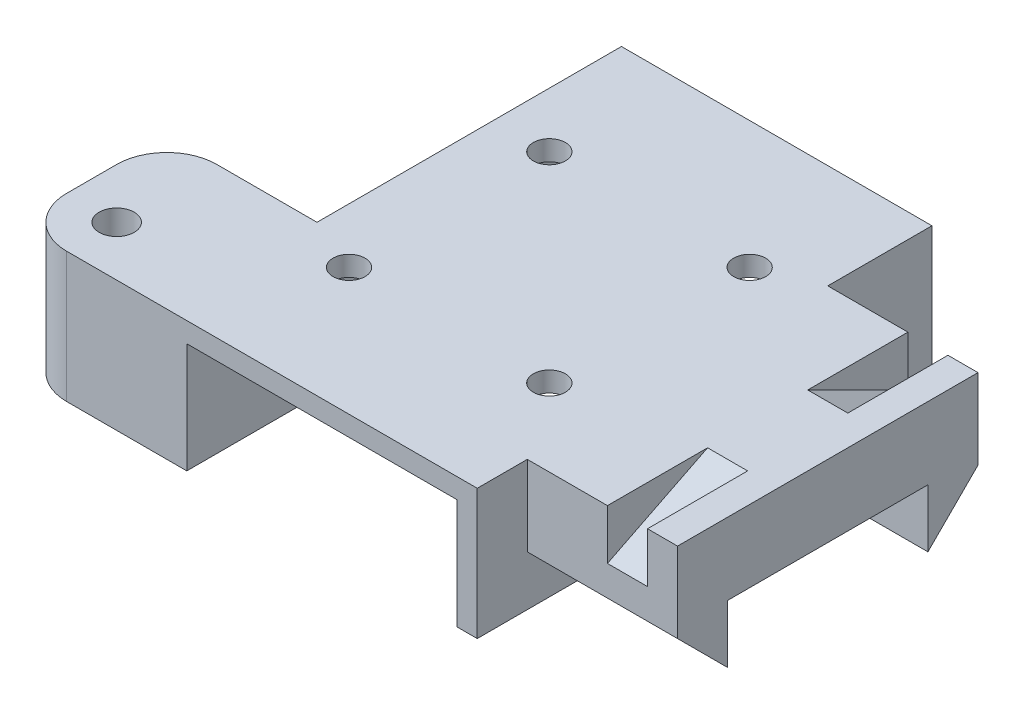
ISO-10303-21;
HEADER;
FILE_DESCRIPTION(('STEP AP214'),'2;1');
FILE_NAME('part.step','',(''),(''),'','','');
FILE_SCHEMA(('AUTOMOTIVE_DESIGN { 1 0 10303 214 1 1 1 1 }'));
ENDSEC;
DATA;
#1=APPLICATION_CONTEXT('core data for automotive mechanical design processes');
#2=APPLICATION_PROTOCOL_DEFINITION('international standard','automotive_design',2000,#1);
#3=PRODUCT_CONTEXT('',#1,'mechanical');
#4=PRODUCT('Part','Part','',(#3));
#5=PRODUCT_RELATED_PRODUCT_CATEGORY('part','',(#4));
#6=PRODUCT_DEFINITION_FORMATION('','',#4);
#7=PRODUCT_DEFINITION_CONTEXT('part definition',#1,'design');
#8=PRODUCT_DEFINITION('design','',#6,#7);
#9=PRODUCT_DEFINITION_SHAPE('','',#8);
#10=(LENGTH_UNIT() NAMED_UNIT(*) SI_UNIT(.MILLI.,.METRE.));
#11=(NAMED_UNIT(*) PLANE_ANGLE_UNIT() SI_UNIT($,.RADIAN.));
#12=(NAMED_UNIT(*) SI_UNIT($,.STERADIAN.) SOLID_ANGLE_UNIT());
#13=UNCERTAINTY_MEASURE_WITH_UNIT(LENGTH_MEASURE(1.E-05),#10,'distance_accuracy_value','');
#14=(GEOMETRIC_REPRESENTATION_CONTEXT(3) GLOBAL_UNCERTAINTY_ASSIGNED_CONTEXT((#13)) GLOBAL_UNIT_ASSIGNED_CONTEXT((#10,
#11,#12)) REPRESENTATION_CONTEXT('',''));
#15=CARTESIAN_POINT('',(0.,0.,0.));
#16=DIRECTION('',(0.,0.,1.));
#17=DIRECTION('',(1.,0.,0.));
#18=AXIS2_PLACEMENT_3D('',#15,#16,#17);
#19=CARTESIAN_POINT('',(0.,13.,0.));
#20=DIRECTION('',(0.,-1.,0.));
#21=DIRECTION('',(0.,0.,-1.));
#22=AXIS2_PLACEMENT_3D('',#19,#20,#21);
#23=PLANE('',#22);
#24=CARTESIAN_POINT('',(25.5,13.,-32.7));
#25=DIRECTION('',(0.,1.,0.));
#26=DIRECTION('',(0.,0.,1.));
#27=AXIS2_PLACEMENT_3D('',#24,#25,#26);
#28=CIRCLE('',#27,1.6);
#29=CARTESIAN_POINT('',(25.5,13.,-31.1));
#30=VERTEX_POINT('',#29);
#31=EDGE_CURVE('E325',#30,#30,#28,.T.);
#32=ORIENTED_EDGE('',*,*,#31,.F.);
#33=EDGE_LOOP('',(#32));
#34=FACE_BOUND('',#33,.T.);
#35=CARTESIAN_POINT('',(5.49999999999999,13.,-12.7));
#36=DIRECTION('',(0.,1.,0.));
#37=DIRECTION('',(0.,0.,1.));
#38=AXIS2_PLACEMENT_3D('',#35,#36,#37);
#39=CIRCLE('',#38,1.6);
#40=CARTESIAN_POINT('',(5.49999999999999,13.,-11.1));
#41=VERTEX_POINT('',#40);
#42=EDGE_CURVE('E318',#41,#41,#39,.T.);
#43=ORIENTED_EDGE('',*,*,#42,.F.);
#44=EDGE_LOOP('',(#43));
#45=FACE_BOUND('',#44,.T.);
#46=CARTESIAN_POINT('',(25.5,13.,-12.7));
#47=DIRECTION('',(0.,1.,0.));
#48=DIRECTION('',(0.,0.,1.));
#49=AXIS2_PLACEMENT_3D('',#46,#47,#48);
#50=CIRCLE('',#49,1.6);
#51=CARTESIAN_POINT('',(25.5,13.,-11.1));
#52=VERTEX_POINT('',#51);
#53=EDGE_CURVE('E321',#52,#52,#50,.T.);
#54=ORIENTED_EDGE('',*,*,#53,.F.);
#55=EDGE_LOOP('',(#54));
#56=FACE_BOUND('',#55,.T.);
#57=CARTESIAN_POINT('',(5.49999999999999,13.,-32.7));
#58=DIRECTION('',(0.,1.,0.));
#59=DIRECTION('',(0.,0.,1.));
#60=AXIS2_PLACEMENT_3D('',#57,#58,#59);
#61=CIRCLE('',#60,1.6);
#62=CARTESIAN_POINT('',(5.49999999999999,13.,-31.1));
#63=VERTEX_POINT('',#62);
#64=EDGE_CURVE('E322',#63,#63,#61,.T.);
#65=ORIENTED_EDGE('',*,*,#64,.F.);
#66=EDGE_LOOP('',(#65));
#67=FACE_BOUND('',#66,.T.);
#68=CARTESIAN_POINT('',(-10.,13.,-5.));
#69=DIRECTION('',(0.,1.,0.));
#70=DIRECTION('',(0.,0.,1.));
#71=AXIS2_PLACEMENT_3D('',#68,#69,#70);
#72=CIRCLE('',#71,1.75);
#73=CARTESIAN_POINT('',(-10.,13.,-3.25));
#74=VERTEX_POINT('',#73);
#75=EDGE_CURVE('E299',#74,#74,#72,.T.);
#76=ORIENTED_EDGE('',*,*,#75,.F.);
#77=EDGE_LOOP('',(#76));
#78=FACE_BOUND('',#77,.T.);
#79=DIRECTION('',(-1.,0.,0.));
#80=VECTOR('',#79,1.);
#81=CARTESIAN_POINT('',(46.,13.,-5.));
#82=LINE('',#81,#80);
#83=CARTESIAN_POINT('',(39.,13.,-5.));
#84=VERTEX_POINT('',#83);
#85=CARTESIAN_POINT('',(31.,13.,-5.));
#86=VERTEX_POINT('',#85);
#87=EDGE_CURVE('E267',#84,#86,#82,.T.);
#88=ORIENTED_EDGE('',*,*,#87,.F.);
#89=DIRECTION('',(0.,0.,1.));
#90=VECTOR('',#89,1.);
#91=CARTESIAN_POINT('',(39.,13.,-15.));
#92=LINE('',#91,#90);
#93=CARTESIAN_POINT('',(39.,13.,-15.));
#94=VERTEX_POINT('',#93);
#95=EDGE_CURVE('E217',#94,#84,#92,.T.);
#96=ORIENTED_EDGE('',*,*,#95,.F.);
#97=DIRECTION('',(1.,0.,0.));
#98=VECTOR('',#97,1.);
#99=CARTESIAN_POINT('',(39.,13.,-15.));
#100=LINE('',#99,#98);
#101=CARTESIAN_POINT('',(43.,13.,-15.));
#102=VERTEX_POINT('',#101);
#103=EDGE_CURVE('E214',#94,#102,#100,.T.);
#104=ORIENTED_EDGE('',*,*,#103,.T.);
#105=DIRECTION('',(0.,0.,1.));
#106=VECTOR('',#105,1.);
#107=CARTESIAN_POINT('',(43.,13.,-15.));
#108=LINE('',#107,#106);
#109=CARTESIAN_POINT('',(43.,13.,-5.));
#110=VERTEX_POINT('',#109);
#111=EDGE_CURVE('E224',#102,#110,#108,.T.);
#112=ORIENTED_EDGE('',*,*,#111,.T.);
#113=CARTESIAN_POINT('',(46.,13.,-5.));
#114=VERTEX_POINT('',#113);
#115=EDGE_CURVE('E281',#114,#110,#82,.T.);
#116=ORIENTED_EDGE('',*,*,#115,.F.);
#117=DIRECTION('',(0.,0.,1.));
#118=VECTOR('',#117,1.);
#119=CARTESIAN_POINT('',(46.,13.,-35.));
#120=LINE('',#119,#118);
#121=CARTESIAN_POINT('',(46.,13.,-35.));
#122=VERTEX_POINT('',#121);
#123=EDGE_CURVE('E265',#122,#114,#120,.T.);
#124=ORIENTED_EDGE('',*,*,#123,.F.);
#125=DIRECTION('',(-1.,0.,0.));
#126=VECTOR('',#125,1.);
#127=CARTESIAN_POINT('',(46.,13.,-35.));
#128=LINE('',#127,#126);
#129=CARTESIAN_POINT('',(43.,13.,-35.));
#130=VERTEX_POINT('',#129);
#131=EDGE_CURVE('E284',#122,#130,#128,.T.);
#132=ORIENTED_EDGE('',*,*,#131,.T.);
#133=DIRECTION('',(0.,0.,1.));
#134=VECTOR('',#133,1.);
#135=CARTESIAN_POINT('',(43.,13.,-25.));
#136=LINE('',#135,#134);
#137=CARTESIAN_POINT('',(43.,13.,-25.));
#138=VERTEX_POINT('',#137);
#139=EDGE_CURVE('E57',#130,#138,#136,.T.);
#140=ORIENTED_EDGE('',*,*,#139,.T.);
#141=DIRECTION('',(1.,0.,0.));
#142=VECTOR('',#141,1.);
#143=CARTESIAN_POINT('',(39.,13.,-25.));
#144=LINE('',#143,#142);
#145=CARTESIAN_POINT('',(39.,13.,-25.));
#146=VERTEX_POINT('',#145);
#147=EDGE_CURVE('E243',#146,#138,#144,.T.);
#148=ORIENTED_EDGE('',*,*,#147,.F.);
#149=DIRECTION('',(0.,0.,1.));
#150=VECTOR('',#149,1.);
#151=CARTESIAN_POINT('',(39.,13.,-25.));
#152=LINE('',#151,#150);
#153=CARTESIAN_POINT('',(39.,13.,-35.));
#154=VERTEX_POINT('',#153);
#155=EDGE_CURVE('E237',#154,#146,#152,.T.);
#156=ORIENTED_EDGE('',*,*,#155,.F.);
#157=CARTESIAN_POINT('',(31.,13.,-35.));
#158=VERTEX_POINT('',#157);
#159=EDGE_CURVE('E283',#154,#158,#128,.T.);
#160=ORIENTED_EDGE('',*,*,#159,.T.);
#161=DIRECTION('',(0.,0.,-1.));
#162=VECTOR('',#161,1.);
#163=CARTESIAN_POINT('',(31.,13.,0.));
#164=LINE('',#163,#162);
#165=CARTESIAN_POINT('',(31.,13.,-45.4));
#166=VERTEX_POINT('',#165);
#167=EDGE_CURVE('E366',#158,#166,#164,.T.);
#168=ORIENTED_EDGE('',*,*,#167,.T.);
#169=DIRECTION('',(-1.,0.,0.));
#170=VECTOR('',#169,1.);
#171=CARTESIAN_POINT('',(0.,13.,-45.4));
#172=LINE('',#171,#170);
#173=CARTESIAN_POINT('',(0.,13.,-45.4));
#174=VERTEX_POINT('',#173);
#175=EDGE_CURVE('E370',#166,#174,#172,.T.);
#176=ORIENTED_EDGE('',*,*,#175,.T.);
#177=DIRECTION('',(0.,0.,1.));
#178=VECTOR('',#177,1.);
#179=CARTESIAN_POINT('',(0.,13.,0.));
#180=LINE('',#179,#178);
#181=CARTESIAN_POINT('',(0.,13.,-15.));
#182=VERTEX_POINT('',#181);
#183=EDGE_CURVE('E360',#174,#182,#180,.T.);
#184=ORIENTED_EDGE('',*,*,#183,.T.);
#185=DIRECTION('',(1.,0.,0.));
#186=VECTOR('',#185,1.);
#187=CARTESIAN_POINT('',(-15.,13.,-15.));
#188=LINE('',#187,#186);
#189=CARTESIAN_POINT('',(-10.,13.,-15.));
#190=VERTEX_POINT('',#189);
#191=EDGE_CURVE('E312',#190,#182,#188,.T.);
#192=ORIENTED_EDGE('',*,*,#191,.F.);
#193=CARTESIAN_POINT('',(-10.,13.,-10.));
#194=DIRECTION('',(0.,-1.,0.));
#195=DIRECTION('',(0.,0.,-1.));
#196=AXIS2_PLACEMENT_3D('',#193,#194,#195);
#197=CIRCLE('',#196,5.);
#198=CARTESIAN_POINT('',(-15.,13.,-9.99999999999999));
#199=VERTEX_POINT('',#198);
#200=EDGE_CURVE('E417',#190,#199,#197,.F.);
#201=ORIENTED_EDGE('',*,*,#200,.T.);
#202=DIRECTION('',(0.,0.,-1.));
#203=VECTOR('',#202,1.);
#204=CARTESIAN_POINT('',(-15.,13.,-15.));
#205=LINE('',#204,#203);
#206=CARTESIAN_POINT('',(-15.,13.,-5.));
#207=VERTEX_POINT('',#206);
#208=EDGE_CURVE('E309',#207,#199,#205,.T.);
#209=ORIENTED_EDGE('',*,*,#208,.F.);
#210=CARTESIAN_POINT('',(-10.,13.,-5.));
#211=DIRECTION('',(0.,-1.,0.));
#212=DIRECTION('',(0.,0.,-1.));
#213=AXIS2_PLACEMENT_3D('',#210,#211,#212);
#214=CIRCLE('',#213,5.);
#215=CARTESIAN_POINT('',(-10.,13.,0.));
#216=VERTEX_POINT('',#215);
#217=EDGE_CURVE('E415',#207,#216,#214,.F.);
#218=ORIENTED_EDGE('',*,*,#217,.T.);
#219=DIRECTION('',(1.,0.,0.));
#220=VECTOR('',#219,1.);
#221=CARTESIAN_POINT('',(0.,13.,0.));
#222=LINE('',#221,#220);
#223=CARTESIAN_POINT('',(31.,13.,0.));
#224=VERTEX_POINT('',#223);
#225=EDGE_CURVE('E363',#216,#224,#222,.T.);
#226=ORIENTED_EDGE('',*,*,#225,.T.);
#227=EDGE_CURVE('E367',#224,#86,#164,.T.);
#228=ORIENTED_EDGE('',*,*,#227,.T.);
#229=EDGE_LOOP('',(#88,#96,#104,#112,#116,#124,#132,#140,#148,#156,#160,#168,#176,#184,#192,
#201,#209,#218,#226,#228));
#230=FACE_BOUND('',#229,.T.);
#231=ADVANCED_FACE('F34',(#34,#45,#56,#67,#78,#230),#23,.F.);
#232=CARTESIAN_POINT('',(46.,0.,-35.));
#233=DIRECTION('',(0.,0.,1.));
#234=DIRECTION('',(1.,0.,0.));
#235=AXIS2_PLACEMENT_3D('',#232,#233,#234);
#236=PLANE('',#235);
#237=DIRECTION('',(0.,1.,0.));
#238=VECTOR('',#237,1.);
#239=CARTESIAN_POINT('',(39.,13.,-35.));
#240=LINE('',#239,#238);
#241=CARTESIAN_POINT('',(39.,8.,-35.));
#242=VERTEX_POINT('',#241);
#243=EDGE_CURVE('E235',#242,#154,#240,.T.);
#244=ORIENTED_EDGE('',*,*,#243,.F.);
#245=DIRECTION('',(1.,0.,0.));
#246=VECTOR('',#245,1.);
#247=CARTESIAN_POINT('',(39.,8.,-35.));
#248=LINE('',#247,#246);
#249=CARTESIAN_POINT('',(43.,8.,-35.));
#250=VERTEX_POINT('',#249);
#251=EDGE_CURVE('E249',#242,#250,#248,.T.);
#252=ORIENTED_EDGE('',*,*,#251,.T.);
#253=DIRECTION('',(0.,1.,0.));
#254=VECTOR('',#253,1.);
#255=CARTESIAN_POINT('',(43.,13.,-35.));
#256=LINE('',#255,#254);
#257=EDGE_CURVE('E244',#250,#130,#256,.T.);
#258=ORIENTED_EDGE('',*,*,#257,.T.);
#259=ORIENTED_EDGE('',*,*,#131,.F.);
#260=DIRECTION('',(0.,1.,0.));
#261=VECTOR('',#260,1.);
#262=CARTESIAN_POINT('',(46.,0.,-35.));
#263=LINE('',#262,#261);
#264=CARTESIAN_POINT('',(46.,5.,-35.));
#265=VERTEX_POINT('',#264);
#266=EDGE_CURVE('E263',#265,#122,#263,.T.);
#267=ORIENTED_EDGE('',*,*,#266,.F.);
#268=DIRECTION('',(-1.,0.,0.));
#269=VECTOR('',#268,1.);
#270=CARTESIAN_POINT('',(31.,5.,-35.));
#271=LINE('',#270,#269);
#272=CARTESIAN_POINT('',(31.,5.,-35.));
#273=VERTEX_POINT('',#272);
#274=EDGE_CURVE('E427',#265,#273,#271,.T.);
#275=ORIENTED_EDGE('',*,*,#274,.T.);
#276=DIRECTION('',(0.,1.,0.));
#277=VECTOR('',#276,1.);
#278=CARTESIAN_POINT('',(31.,0.,-35.));
#279=LINE('',#278,#277);
#280=EDGE_CURVE('E257',#273,#158,#279,.T.);
#281=ORIENTED_EDGE('',*,*,#280,.T.);
#282=ORIENTED_EDGE('',*,*,#159,.F.);
#283=EDGE_LOOP('',(#244,#252,#258,#259,#267,#275,#281,#282));
#284=FACE_BOUND('',#283,.T.);
#285=ADVANCED_FACE('F463',(#284),#236,.F.);
#286=CARTESIAN_POINT('',(31.,13.,0.));
#287=DIRECTION('',(-1.,0.,0.));
#288=DIRECTION('',(0.,0.,1.));
#289=AXIS2_PLACEMENT_3D('',#286,#287,#288);
#290=PLANE('',#289);
#291=DIRECTION('',(0.,-1.,0.));
#292=VECTOR('',#291,1.);
#293=CARTESIAN_POINT('',(31.,13.,-5.));
#294=LINE('',#293,#292);
#295=CARTESIAN_POINT('',(31.,5.00000000000002,-5.));
#296=VERTEX_POINT('',#295);
#297=EDGE_CURVE('E230',#86,#296,#294,.T.);
#298=ORIENTED_EDGE('',*,*,#297,.F.);
#299=ORIENTED_EDGE('',*,*,#227,.F.);
#300=DIRECTION('',(0.,-1.,0.));
#301=VECTOR('',#300,1.);
#302=CARTESIAN_POINT('',(31.,13.,0.));
#303=LINE('',#302,#301);
#304=CARTESIAN_POINT('',(31.,0.,0.));
#305=VERTEX_POINT('',#304);
#306=EDGE_CURVE('E390',#224,#305,#303,.T.);
#307=ORIENTED_EDGE('',*,*,#306,.T.);
#308=DIRECTION('',(0.,0.,-1.));
#309=VECTOR('',#308,1.);
#310=CARTESIAN_POINT('',(31.,0.,0.));
#311=LINE('',#310,#309);
#312=CARTESIAN_POINT('',(31.,0.,-10.));
#313=VERTEX_POINT('',#312);
#314=EDGE_CURVE('E379',#305,#313,#311,.T.);
#315=ORIENTED_EDGE('',*,*,#314,.T.);
#316=DIRECTION('',(0.,0.707106781186549,0.707106781186546));
#317=VECTOR('',#316,1.);
#318=CARTESIAN_POINT('',(31.,11.5,1.49999999999997));
#319=LINE('',#318,#317);
#320=EDGE_CURVE('E42',#313,#296,#319,.T.);
#321=ORIENTED_EDGE('',*,*,#320,.T.);
#322=EDGE_LOOP('',(#298,#299,#307,#315,#321));
#323=FACE_BOUND('',#322,.T.);
#324=ADVANCED_FACE('F432',(#323),#290,.F.);
#325=ORIENTED_EDGE('',*,*,#280,.F.);
#326=DIRECTION('',(0.,-0.707106781186547,0.707106781186549));
#327=VECTOR('',#326,1.);
#328=CARTESIAN_POINT('',(31.,-8.50000000000001,-21.4999999999999));
#329=LINE('',#328,#327);
#330=CARTESIAN_POINT('',(31.,0.,-30.));
#331=VERTEX_POINT('',#330);
#332=EDGE_CURVE('E11',#273,#331,#329,.T.);
#333=ORIENTED_EDGE('',*,*,#332,.T.);
#334=CARTESIAN_POINT('',(31.,0.,-45.4));
#335=VERTEX_POINT('',#334);
#336=EDGE_CURVE('E378',#331,#335,#311,.T.);
#337=ORIENTED_EDGE('',*,*,#336,.T.);
#338=DIRECTION('',(0.,-1.,0.));
#339=VECTOR('',#338,1.);
#340=CARTESIAN_POINT('',(31.,13.,-45.4));
#341=LINE('',#340,#339);
#342=EDGE_CURVE('E387',#166,#335,#341,.T.);
#343=ORIENTED_EDGE('',*,*,#342,.F.);
#344=ORIENTED_EDGE('',*,*,#167,.F.);
#345=EDGE_LOOP('',(#325,#333,#337,#343,#344));
#346=FACE_BOUND('',#345,.T.);
#347=ADVANCED_FACE('F468',(#346),#290,.F.);
#348=DIRECTION('',(0.,-1.,0.));
#349=VECTOR('',#348,1.);
#350=CARTESIAN_POINT('',(31.,5.8,-30.));
#351=LINE('',#350,#349);
#352=CARTESIAN_POINT('',(31.,5.8,-30.));
#353=VERTEX_POINT('',#352);
#354=EDGE_CURVE('E276',#353,#331,#351,.T.);
#355=ORIENTED_EDGE('',*,*,#354,.F.);
#356=DIRECTION('',(0.,0.,-1.));
#357=VECTOR('',#356,1.);
#358=CARTESIAN_POINT('',(31.,5.8,-10.));
#359=LINE('',#358,#357);
#360=CARTESIAN_POINT('',(31.,5.8,-10.));
#361=VERTEX_POINT('',#360);
#362=EDGE_CURVE('E273',#361,#353,#359,.T.);
#363=ORIENTED_EDGE('',*,*,#362,.F.);
#364=DIRECTION('',(0.,1.,0.));
#365=VECTOR('',#364,1.);
#366=CARTESIAN_POINT('',(31.,0.,-10.));
#367=LINE('',#366,#365);
#368=EDGE_CURVE('E270',#313,#361,#367,.T.);
#369=ORIENTED_EDGE('',*,*,#368,.F.);
#370=EDGE_CURVE('E382',#313,#331,#311,.T.);
#371=ORIENTED_EDGE('',*,*,#370,.T.);
#372=EDGE_LOOP('',(#355,#363,#369,#371));
#373=FACE_BOUND('',#372,.T.);
#374=ADVANCED_FACE('F518',(#373),#290,.F.);
#375=CARTESIAN_POINT('',(0.,13.,0.));
#376=DIRECTION('',(1.,0.,0.));
#377=DIRECTION('',(0.,0.,-1.));
#378=AXIS2_PLACEMENT_3D('',#375,#376,#377);
#379=PLANE('',#378);
#380=DIRECTION('',(0.,-1.,0.));
#381=VECTOR('',#380,1.);
#382=CARTESIAN_POINT('',(0.,13.,-15.));
#383=LINE('',#382,#381);
#384=CARTESIAN_POINT('',(0.,0.,-15.));
#385=VERTEX_POINT('',#384);
#386=EDGE_CURVE('E305',#182,#385,#383,.T.);
#387=ORIENTED_EDGE('',*,*,#386,.F.);
#388=ORIENTED_EDGE('',*,*,#183,.F.);
#389=DIRECTION('',(0.,-1.,0.));
#390=VECTOR('',#389,1.);
#391=CARTESIAN_POINT('',(0.,13.,-45.4));
#392=LINE('',#391,#390);
#393=CARTESIAN_POINT('',(0.,0.,-45.4));
#394=VERTEX_POINT('',#393);
#395=EDGE_CURVE('E372',#174,#394,#392,.T.);
#396=ORIENTED_EDGE('',*,*,#395,.T.);
#397=DIRECTION('',(0.,0.,1.));
#398=VECTOR('',#397,1.);
#399=CARTESIAN_POINT('',(0.,0.,0.));
#400=LINE('',#399,#398);
#401=EDGE_CURVE('E353',#394,#385,#400,.T.);
#402=ORIENTED_EDGE('',*,*,#401,.T.);
#403=EDGE_LOOP('',(#387,#388,#396,#402));
#404=FACE_BOUND('',#403,.T.);
#405=ADVANCED_FACE('F522',(#404),#379,.F.);
#406=CARTESIAN_POINT('',(0.,0.,0.));
#407=DIRECTION('',(0.,-1.,0.));
#408=DIRECTION('',(0.,0.,-1.));
#409=AXIS2_PLACEMENT_3D('',#406,#407,#408);
#410=PLANE('',#409);
#411=CARTESIAN_POINT('',(-10.,0.,-5.));
#412=DIRECTION('',(0.,-1.,0.));
#413=DIRECTION('',(0.,0.,-1.));
#414=AXIS2_PLACEMENT_3D('',#411,#412,#413);
#415=CIRCLE('',#414,1.75);
#416=CARTESIAN_POINT('',(-10.,0.,-6.75));
#417=VERTEX_POINT('',#416);
#418=EDGE_CURVE('E302',#417,#417,#415,.T.);
#419=ORIENTED_EDGE('',*,*,#418,.F.);
#420=EDGE_LOOP('',(#419));
#421=FACE_BOUND('',#420,.T.);
#422=DIRECTION('',(0.,0.,1.));
#423=VECTOR('',#422,1.);
#424=CARTESIAN_POINT('',(-15.,0.,-15.));
#425=LINE('',#424,#423);
#426=CARTESIAN_POINT('',(-15.,0.,-9.99999999999999));
#427=VERTEX_POINT('',#426);
#428=CARTESIAN_POINT('',(-15.,0.,-5.));
#429=VERTEX_POINT('',#428);
#430=EDGE_CURVE('E306',#427,#429,#425,.T.);
#431=ORIENTED_EDGE('',*,*,#430,.F.);
#432=CARTESIAN_POINT('',(-10.,0.,-9.99999999999999));
#433=DIRECTION('',(0.,-1.,0.));
#434=DIRECTION('',(0.,0.,-1.));
#435=AXIS2_PLACEMENT_3D('',#432,#433,#434);
#436=CIRCLE('',#435,5.);
#437=CARTESIAN_POINT('',(-10.,0.,-15.));
#438=VERTEX_POINT('',#437);
#439=EDGE_CURVE('E411',#427,#438,#436,.T.);
#440=ORIENTED_EDGE('',*,*,#439,.T.);
#441=DIRECTION('',(1.,0.,0.));
#442=VECTOR('',#441,1.);
#443=CARTESIAN_POINT('',(-15.,0.,-15.));
#444=LINE('',#443,#442);
#445=EDGE_CURVE('E316',#438,#385,#444,.T.);
#446=ORIENTED_EDGE('',*,*,#445,.T.);
#447=ORIENTED_EDGE('',*,*,#401,.F.);
#448=DIRECTION('',(-1.,0.,0.));
#449=VECTOR('',#448,1.);
#450=CARTESIAN_POINT('',(0.,0.,-45.4));
#451=LINE('',#450,#449);
#452=CARTESIAN_POINT('',(2.,0.,-45.4));
#453=VERTEX_POINT('',#452);
#454=EDGE_CURVE('E381',#453,#394,#451,.T.);
#455=ORIENTED_EDGE('',*,*,#454,.F.);
#456=DIRECTION('',(0.,0.,1.));
#457=VECTOR('',#456,1.);
#458=CARTESIAN_POINT('',(2.,0.,-45.4));
#459=LINE('',#458,#457);
#460=CARTESIAN_POINT('',(2.,0.,0.));
#461=VERTEX_POINT('',#460);
#462=EDGE_CURVE('E341',#453,#461,#459,.T.);
#463=ORIENTED_EDGE('',*,*,#462,.T.);
#464=DIRECTION('',(1.,0.,0.));
#465=VECTOR('',#464,1.);
#466=CARTESIAN_POINT('',(0.,0.,0.));
#467=LINE('',#466,#465);
#468=CARTESIAN_POINT('',(-10.,0.,0.));
#469=VERTEX_POINT('',#468);
#470=EDGE_CURVE('E376',#469,#461,#467,.T.);
#471=ORIENTED_EDGE('',*,*,#470,.F.);
#472=CARTESIAN_POINT('',(-10.,0.,-5.));
#473=DIRECTION('',(0.,-1.,0.));
#474=DIRECTION('',(0.,0.,-1.));
#475=AXIS2_PLACEMENT_3D('',#472,#473,#474);
#476=CIRCLE('',#475,5.);
#477=EDGE_CURVE('E409',#469,#429,#476,.T.);
#478=ORIENTED_EDGE('',*,*,#477,.T.);
#479=EDGE_LOOP('',(#431,#440,#446,#447,#455,#463,#471,#478));
#480=FACE_BOUND('',#479,.T.);
#481=ADVANCED_FACE('F511',(#421,#480),#410,.T.);
#482=CARTESIAN_POINT('',(0.,13.,0.));
#483=DIRECTION('',(0.,0.,-1.));
#484=DIRECTION('',(-1.,0.,0.));
#485=AXIS2_PLACEMENT_3D('',#482,#483,#484);
#486=PLANE('',#485);
#487=ORIENTED_EDGE('',*,*,#225,.F.);
#488=DIRECTION('',(0.,1.,0.));
#489=VECTOR('',#488,1.);
#490=CARTESIAN_POINT('',(-10.,0.,0.));
#491=LINE('',#490,#489);
#492=EDGE_CURVE('E419',#216,#469,#491,.F.);
#493=ORIENTED_EDGE('',*,*,#492,.T.);
#494=ORIENTED_EDGE('',*,*,#470,.T.);
#495=DIRECTION('',(0.,-1.,0.));
#496=VECTOR('',#495,1.);
#497=CARTESIAN_POINT('',(2.,0.,0.));
#498=LINE('',#497,#496);
#499=CARTESIAN_POINT('',(2.,11.,0.));
#500=VERTEX_POINT('',#499);
#501=EDGE_CURVE('E342',#500,#461,#498,.T.);
#502=ORIENTED_EDGE('',*,*,#501,.F.);
#503=DIRECTION('',(-1.,0.,0.));
#504=VECTOR('',#503,1.);
#505=CARTESIAN_POINT('',(2.,11.,0.));
#506=LINE('',#505,#504);
#507=CARTESIAN_POINT('',(29.,11.,0.));
#508=VERTEX_POINT('',#507);
#509=EDGE_CURVE('E335',#508,#500,#506,.T.);
#510=ORIENTED_EDGE('',*,*,#509,.F.);
#511=DIRECTION('',(0.,1.,0.));
#512=VECTOR('',#511,1.);
#513=CARTESIAN_POINT('',(29.,0.,0.));
#514=LINE('',#513,#512);
#515=CARTESIAN_POINT('',(29.,0.,0.));
#516=VERTEX_POINT('',#515);
#517=EDGE_CURVE('E345',#516,#508,#514,.T.);
#518=ORIENTED_EDGE('',*,*,#517,.F.);
#519=EDGE_CURVE('E375',#516,#305,#467,.T.);
#520=ORIENTED_EDGE('',*,*,#519,.T.);
#521=ORIENTED_EDGE('',*,*,#306,.F.);
#522=EDGE_LOOP('',(#487,#493,#494,#502,#510,#518,#520,#521));
#523=FACE_BOUND('',#522,.T.);
#524=ADVANCED_FACE('F514',(#523),#486,.F.);
#525=CARTESIAN_POINT('',(0.,13.,-45.4));
#526=DIRECTION('',(0.,0.,1.));
#527=DIRECTION('',(1.,0.,0.));
#528=AXIS2_PLACEMENT_3D('',#525,#526,#527);
#529=PLANE('',#528);
#530=DIRECTION('',(-1.,0.,0.));
#531=VECTOR('',#530,1.);
#532=CARTESIAN_POINT('',(2.,11.,-45.4));
#533=LINE('',#532,#531);
#534=CARTESIAN_POINT('',(29.,11.,-45.4));
#535=VERTEX_POINT('',#534);
#536=CARTESIAN_POINT('',(2.,11.,-45.4));
#537=VERTEX_POINT('',#536);
#538=EDGE_CURVE('E338',#535,#537,#533,.T.);
#539=ORIENTED_EDGE('',*,*,#538,.T.);
#540=DIRECTION('',(0.,-1.,0.));
#541=VECTOR('',#540,1.);
#542=CARTESIAN_POINT('',(2.,0.,-45.4));
#543=LINE('',#542,#541);
#544=EDGE_CURVE('E331',#537,#453,#543,.T.);
#545=ORIENTED_EDGE('',*,*,#544,.T.);
#546=ORIENTED_EDGE('',*,*,#454,.T.);
#547=ORIENTED_EDGE('',*,*,#395,.F.);
#548=ORIENTED_EDGE('',*,*,#175,.F.);
#549=ORIENTED_EDGE('',*,*,#342,.T.);
#550=CARTESIAN_POINT('',(29.,0.,-45.4));
#551=VERTEX_POINT('',#550);
#552=EDGE_CURVE('E364',#335,#551,#451,.T.);
#553=ORIENTED_EDGE('',*,*,#552,.T.);
#554=DIRECTION('',(0.,1.,0.));
#555=VECTOR('',#554,1.);
#556=CARTESIAN_POINT('',(29.,0.,-45.4));
#557=LINE('',#556,#555);
#558=EDGE_CURVE('E334',#551,#535,#557,.T.);
#559=ORIENTED_EDGE('',*,*,#558,.T.);
#560=EDGE_LOOP('',(#539,#545,#546,#547,#548,#549,#553,#559));
#561=FACE_BOUND('',#560,.T.);
#562=ADVANCED_FACE('F509',(#561),#529,.F.);
#563=ORIENTED_EDGE('',*,*,#370,.F.);
#564=ORIENTED_EDGE('',*,*,#314,.F.);
#565=ORIENTED_EDGE('',*,*,#519,.F.);
#566=DIRECTION('',(0.,0.,1.));
#567=VECTOR('',#566,1.);
#568=CARTESIAN_POINT('',(29.,0.,-45.4));
#569=LINE('',#568,#567);
#570=EDGE_CURVE('E356',#551,#516,#569,.T.);
#571=ORIENTED_EDGE('',*,*,#570,.F.);
#572=ORIENTED_EDGE('',*,*,#552,.F.);
#573=ORIENTED_EDGE('',*,*,#336,.F.);
#574=EDGE_LOOP('',(#563,#564,#565,#571,#572,#573));
#575=FACE_BOUND('',#574,.T.);
#576=ADVANCED_FACE('F506',(#575),#410,.T.);
#577=CARTESIAN_POINT('',(2.,0.,-45.4));
#578=DIRECTION('',(-1.,0.,0.));
#579=DIRECTION('',(0.,0.,1.));
#580=AXIS2_PLACEMENT_3D('',#577,#578,#579);
#581=PLANE('',#580);
#582=ORIENTED_EDGE('',*,*,#501,.T.);
#583=ORIENTED_EDGE('',*,*,#462,.F.);
#584=ORIENTED_EDGE('',*,*,#544,.F.);
#585=DIRECTION('',(0.,0.,1.));
#586=VECTOR('',#585,1.);
#587=CARTESIAN_POINT('',(2.,11.,-45.4));
#588=LINE('',#587,#586);
#589=EDGE_CURVE('E351',#537,#500,#588,.T.);
#590=ORIENTED_EDGE('',*,*,#589,.T.);
#591=EDGE_LOOP('',(#582,#583,#584,#590));
#592=FACE_BOUND('',#591,.T.);
#593=ADVANCED_FACE('F504',(#592),#581,.F.);
#594=CARTESIAN_POINT('',(2.,11.,-45.4));
#595=DIRECTION('',(0.,1.,0.));
#596=DIRECTION('',(0.,0.,1.));
#597=AXIS2_PLACEMENT_3D('',#594,#595,#596);
#598=PLANE('',#597);
#599=CARTESIAN_POINT('',(5.49999999999999,11.,-32.7));
#600=DIRECTION('',(0.,1.,0.));
#601=DIRECTION('',(0.,0.,1.));
#602=AXIS2_PLACEMENT_3D('',#599,#600,#601);
#603=CIRCLE('',#602,1.6);
#604=CARTESIAN_POINT('',(5.49999999999999,11.,-31.1));
#605=VERTEX_POINT('',#604);
#606=EDGE_CURVE('E346',#605,#605,#603,.T.);
#607=ORIENTED_EDGE('',*,*,#606,.T.);
#608=EDGE_LOOP('',(#607));
#609=FACE_BOUND('',#608,.T.);
#610=CARTESIAN_POINT('',(25.5,11.,-12.7));
#611=DIRECTION('',(0.,1.,0.));
#612=DIRECTION('',(0.,0.,1.));
#613=AXIS2_PLACEMENT_3D('',#610,#611,#612);
#614=CIRCLE('',#613,1.6);
#615=CARTESIAN_POINT('',(25.5,11.,-11.1));
#616=VERTEX_POINT('',#615);
#617=EDGE_CURVE('E399',#616,#616,#614,.T.);
#618=ORIENTED_EDGE('',*,*,#617,.T.);
#619=EDGE_LOOP('',(#618));
#620=FACE_BOUND('',#619,.T.);
#621=CARTESIAN_POINT('',(5.49999999999999,11.,-12.7));
#622=DIRECTION('',(0.,1.,0.));
#623=DIRECTION('',(0.,0.,1.));
#624=AXIS2_PLACEMENT_3D('',#621,#622,#623);
#625=CIRCLE('',#624,1.6);
#626=CARTESIAN_POINT('',(5.49999999999999,11.,-11.1));
#627=VERTEX_POINT('',#626);
#628=EDGE_CURVE('E396',#627,#627,#625,.T.);
#629=ORIENTED_EDGE('',*,*,#628,.T.);
#630=EDGE_LOOP('',(#629));
#631=FACE_BOUND('',#630,.T.);
#632=CARTESIAN_POINT('',(25.5,11.,-32.7));
#633=DIRECTION('',(0.,1.,0.));
#634=DIRECTION('',(0.,0.,1.));
#635=AXIS2_PLACEMENT_3D('',#632,#633,#634);
#636=CIRCLE('',#635,1.6);
#637=CARTESIAN_POINT('',(25.5,11.,-31.1));
#638=VERTEX_POINT('',#637);
#639=EDGE_CURVE('E330',#638,#638,#636,.T.);
#640=ORIENTED_EDGE('',*,*,#639,.T.);
#641=EDGE_LOOP('',(#640));
#642=FACE_BOUND('',#641,.T.);
#643=ORIENTED_EDGE('',*,*,#509,.T.);
#644=ORIENTED_EDGE('',*,*,#589,.F.);
#645=ORIENTED_EDGE('',*,*,#538,.F.);
#646=DIRECTION('',(0.,0.,1.));
#647=VECTOR('',#646,1.);
#648=CARTESIAN_POINT('',(29.,11.,-45.4));
#649=LINE('',#648,#647);
#650=EDGE_CURVE('E354',#535,#508,#649,.T.);
#651=ORIENTED_EDGE('',*,*,#650,.T.);
#652=EDGE_LOOP('',(#643,#644,#645,#651));
#653=FACE_BOUND('',#652,.T.);
#654=ADVANCED_FACE('F579',(#609,#620,#631,#642,#653),#598,.F.);
#655=CARTESIAN_POINT('',(29.,0.,-45.4));
#656=DIRECTION('',(1.,0.,0.));
#657=DIRECTION('',(0.,0.,-1.));
#658=AXIS2_PLACEMENT_3D('',#655,#656,#657);
#659=PLANE('',#658);
#660=ORIENTED_EDGE('',*,*,#517,.T.);
#661=ORIENTED_EDGE('',*,*,#650,.F.);
#662=ORIENTED_EDGE('',*,*,#558,.F.);
#663=ORIENTED_EDGE('',*,*,#570,.T.);
#664=EDGE_LOOP('',(#660,#661,#662,#663));
#665=FACE_BOUND('',#664,.T.);
#666=ADVANCED_FACE('F577',(#665),#659,.F.);
#667=CARTESIAN_POINT('',(25.5,3.,-32.7));
#668=DIRECTION('',(0.,1.,0.));
#669=DIRECTION('',(0.,0.,1.));
#670=AXIS2_PLACEMENT_3D('',#667,#668,#669);
#671=CYLINDRICAL_SURFACE('',#670,1.6);
#672=ORIENTED_EDGE('',*,*,#31,.T.);
#673=EDGE_LOOP('',(#672));
#674=FACE_BOUND('',#673,.T.);
#675=ORIENTED_EDGE('',*,*,#639,.F.);
#676=EDGE_LOOP('',(#675));
#677=FACE_BOUND('',#676,.T.);
#678=ADVANCED_FACE('F567',(#674,#677),#671,.F.);
#679=CARTESIAN_POINT('',(5.49999999999999,3.,-12.7));
#680=DIRECTION('',(0.,1.,0.));
#681=DIRECTION('',(0.,0.,1.));
#682=AXIS2_PLACEMENT_3D('',#679,#680,#681);
#683=CYLINDRICAL_SURFACE('',#682,1.6);
#684=ORIENTED_EDGE('',*,*,#42,.T.);
#685=EDGE_LOOP('',(#684));
#686=FACE_BOUND('',#685,.T.);
#687=ORIENTED_EDGE('',*,*,#628,.F.);
#688=EDGE_LOOP('',(#687));
#689=FACE_BOUND('',#688,.T.);
#690=ADVANCED_FACE('F563',(#686,#689),#683,.F.);
#691=CARTESIAN_POINT('',(25.5,3.,-12.7));
#692=DIRECTION('',(0.,1.,0.));
#693=DIRECTION('',(0.,0.,1.));
#694=AXIS2_PLACEMENT_3D('',#691,#692,#693);
#695=CYLINDRICAL_SURFACE('',#694,1.6);
#696=ORIENTED_EDGE('',*,*,#53,.T.);
#697=EDGE_LOOP('',(#696));
#698=FACE_BOUND('',#697,.T.);
#699=ORIENTED_EDGE('',*,*,#617,.F.);
#700=EDGE_LOOP('',(#699));
#701=FACE_BOUND('',#700,.T.);
#702=ADVANCED_FACE('F566',(#698,#701),#695,.F.);
#703=CARTESIAN_POINT('',(5.49999999999999,3.,-32.7));
#704=DIRECTION('',(0.,1.,0.));
#705=DIRECTION('',(0.,0.,1.));
#706=AXIS2_PLACEMENT_3D('',#703,#704,#705);
#707=CYLINDRICAL_SURFACE('',#706,1.6);
#708=ORIENTED_EDGE('',*,*,#64,.T.);
#709=EDGE_LOOP('',(#708));
#710=FACE_BOUND('',#709,.T.);
#711=ORIENTED_EDGE('',*,*,#606,.F.);
#712=EDGE_LOOP('',(#711));
#713=FACE_BOUND('',#712,.T.);
#714=ADVANCED_FACE('F561',(#710,#713),#707,.F.);
#715=CARTESIAN_POINT('',(-15.,13.,-15.));
#716=DIRECTION('',(0.,0.,1.));
#717=DIRECTION('',(1.,0.,0.));
#718=AXIS2_PLACEMENT_3D('',#715,#716,#717);
#719=PLANE('',#718);
#720=ORIENTED_EDGE('',*,*,#445,.F.);
#721=DIRECTION('',(0.,-1.,0.));
#722=VECTOR('',#721,1.);
#723=CARTESIAN_POINT('',(-10.,13.,-15.));
#724=LINE('',#723,#722);
#725=EDGE_CURVE('E413',#438,#190,#724,.F.);
#726=ORIENTED_EDGE('',*,*,#725,.T.);
#727=ORIENTED_EDGE('',*,*,#191,.T.);
#728=ORIENTED_EDGE('',*,*,#386,.T.);
#729=EDGE_LOOP('',(#720,#726,#727,#728));
#730=FACE_BOUND('',#729,.T.);
#731=ADVANCED_FACE('F557',(#730),#719,.F.);
#732=CARTESIAN_POINT('',(-15.,0.,0.));
#733=DIRECTION('',(-1.,0.,0.));
#734=DIRECTION('',(0.,0.,1.));
#735=AXIS2_PLACEMENT_3D('',#732,#733,#734);
#736=PLANE('',#735);
#737=ORIENTED_EDGE('',*,*,#208,.T.);
#738=DIRECTION('',(0.,-1.,0.));
#739=VECTOR('',#738,1.);
#740=CARTESIAN_POINT('',(-15.,0.,-9.99999999999999));
#741=LINE('',#740,#739);
#742=EDGE_CURVE('E406',#199,#427,#741,.T.);
#743=ORIENTED_EDGE('',*,*,#742,.T.);
#744=ORIENTED_EDGE('',*,*,#430,.T.);
#745=DIRECTION('',(0.,1.,0.));
#746=VECTOR('',#745,1.);
#747=CARTESIAN_POINT('',(-15.,13.,-5.));
#748=LINE('',#747,#746);
#749=EDGE_CURVE('E393',#429,#207,#748,.T.);
#750=ORIENTED_EDGE('',*,*,#749,.T.);
#751=EDGE_LOOP('',(#737,#743,#744,#750));
#752=FACE_BOUND('',#751,.T.);
#753=ADVANCED_FACE('F553',(#752),#736,.T.);
#754=CARTESIAN_POINT('',(-10.,-7.,-5.));
#755=DIRECTION('',(0.,1.,0.));
#756=DIRECTION('',(0.,0.,1.));
#757=AXIS2_PLACEMENT_3D('',#754,#755,#756);
#758=CYLINDRICAL_SURFACE('',#757,1.75);
#759=ORIENTED_EDGE('',*,*,#418,.T.);
#760=EDGE_LOOP('',(#759));
#761=FACE_BOUND('',#760,.T.);
#762=ORIENTED_EDGE('',*,*,#75,.T.);
#763=EDGE_LOOP('',(#762));
#764=FACE_BOUND('',#763,.T.);
#765=ADVANCED_FACE('F530',(#761,#764),#758,.F.);
#766=CARTESIAN_POINT('',(-10.,0.,-9.99999999999999));
#767=DIRECTION('',(0.,1.,0.));
#768=DIRECTION('',(0.,0.,1.));
#769=AXIS2_PLACEMENT_3D('',#766,#767,#768);
#770=CYLINDRICAL_SURFACE('',#769,5.);
#771=ORIENTED_EDGE('',*,*,#200,.F.);
#772=ORIENTED_EDGE('',*,*,#725,.F.);
#773=ORIENTED_EDGE('',*,*,#439,.F.);
#774=ORIENTED_EDGE('',*,*,#742,.F.);
#775=EDGE_LOOP('',(#771,#772,#773,#774));
#776=FACE_BOUND('',#775,.T.);
#777=ADVANCED_FACE('F526',(#776),#770,.T.);
#778=CARTESIAN_POINT('',(-10.,0.,-5.));
#779=DIRECTION('',(0.,-1.,0.));
#780=DIRECTION('',(1.,0.,0.));
#781=AXIS2_PLACEMENT_3D('',#778,#779,#780);
#782=CYLINDRICAL_SURFACE('',#781,5.);
#783=ORIENTED_EDGE('',*,*,#477,.F.);
#784=ORIENTED_EDGE('',*,*,#492,.F.);
#785=ORIENTED_EDGE('',*,*,#217,.F.);
#786=ORIENTED_EDGE('',*,*,#749,.F.);
#787=EDGE_LOOP('',(#783,#784,#785,#786));
#788=FACE_BOUND('',#787,.T.);
#789=ADVANCED_FACE('F529',(#788),#782,.T.);
#790=CARTESIAN_POINT('',(46.,13.,-5.));
#791=DIRECTION('',(0.,0.,-1.));
#792=DIRECTION('',(-1.,0.,0.));
#793=AXIS2_PLACEMENT_3D('',#790,#791,#792);
#794=PLANE('',#793);
#795=DIRECTION('',(1.,0.,0.));
#796=VECTOR('',#795,1.);
#797=CARTESIAN_POINT('',(39.,8.,-5.));
#798=LINE('',#797,#796);
#799=CARTESIAN_POINT('',(39.,8.,-5.));
#800=VERTEX_POINT('',#799);
#801=CARTESIAN_POINT('',(43.,8.,-5.));
#802=VERTEX_POINT('',#801);
#803=EDGE_CURVE('E211',#800,#802,#798,.T.);
#804=ORIENTED_EDGE('',*,*,#803,.F.);
#805=DIRECTION('',(0.,-1.,0.));
#806=VECTOR('',#805,1.);
#807=CARTESIAN_POINT('',(39.,13.,-5.));
#808=LINE('',#807,#806);
#809=EDGE_CURVE('E218',#84,#800,#808,.T.);
#810=ORIENTED_EDGE('',*,*,#809,.F.);
#811=ORIENTED_EDGE('',*,*,#87,.T.);
#812=ORIENTED_EDGE('',*,*,#297,.T.);
#813=DIRECTION('',(1.,0.,0.));
#814=VECTOR('',#813,1.);
#815=CARTESIAN_POINT('',(46.,5.00000000000002,-5.));
#816=LINE('',#815,#814);
#817=CARTESIAN_POINT('',(46.,5.00000000000002,-5.));
#818=VERTEX_POINT('',#817);
#819=EDGE_CURVE('E421',#296,#818,#816,.T.);
#820=ORIENTED_EDGE('',*,*,#819,.T.);
#821=DIRECTION('',(0.,-1.,0.));
#822=VECTOR('',#821,1.);
#823=CARTESIAN_POINT('',(46.,13.,-5.));
#824=LINE('',#823,#822);
#825=EDGE_CURVE('E253',#114,#818,#824,.T.);
#826=ORIENTED_EDGE('',*,*,#825,.F.);
#827=ORIENTED_EDGE('',*,*,#115,.T.);
#828=DIRECTION('',(0.,-1.,0.));
#829=VECTOR('',#828,1.);
#830=CARTESIAN_POINT('',(43.,13.,-5.));
#831=LINE('',#830,#829);
#832=EDGE_CURVE('E228',#110,#802,#831,.T.);
#833=ORIENTED_EDGE('',*,*,#832,.T.);
#834=EDGE_LOOP('',(#804,#810,#811,#812,#820,#826,#827,#833));
#835=FACE_BOUND('',#834,.T.);
#836=ADVANCED_FACE('F226',(#835),#794,.F.);
#837=CARTESIAN_POINT('',(46.,0.,-10.));
#838=DIRECTION('',(0.,0.,1.));
#839=DIRECTION('',(1.,0.,0.));
#840=AXIS2_PLACEMENT_3D('',#837,#838,#839);
#841=PLANE('',#840);
#842=ORIENTED_EDGE('',*,*,#368,.T.);
#843=DIRECTION('',(-1.,0.,0.));
#844=VECTOR('',#843,1.);
#845=CARTESIAN_POINT('',(46.,5.8,-10.));
#846=LINE('',#845,#844);
#847=CARTESIAN_POINT('',(46.,5.8,-10.));
#848=VERTEX_POINT('',#847);
#849=EDGE_CURVE('E293',#848,#361,#846,.T.);
#850=ORIENTED_EDGE('',*,*,#849,.F.);
#851=DIRECTION('',(0.,1.,0.));
#852=VECTOR('',#851,1.);
#853=CARTESIAN_POINT('',(46.,0.,-10.));
#854=LINE('',#853,#852);
#855=CARTESIAN_POINT('',(46.,0.,-10.));
#856=VERTEX_POINT('',#855);
#857=EDGE_CURVE('E256',#856,#848,#854,.T.);
#858=ORIENTED_EDGE('',*,*,#857,.F.);
#859=DIRECTION('',(-1.,0.,0.));
#860=VECTOR('',#859,1.);
#861=CARTESIAN_POINT('',(46.,0.,-10.));
#862=LINE('',#861,#860);
#863=EDGE_CURVE('E296',#856,#313,#862,.T.);
#864=ORIENTED_EDGE('',*,*,#863,.T.);
#865=EDGE_LOOP('',(#842,#850,#858,#864));
#866=FACE_BOUND('',#865,.T.);
#867=ADVANCED_FACE('F447',(#866),#841,.F.);
#868=CARTESIAN_POINT('',(46.,5.8,-10.));
#869=DIRECTION('',(0.,1.,0.));
#870=DIRECTION('',(0.,0.,1.));
#871=AXIS2_PLACEMENT_3D('',#868,#869,#870);
#872=PLANE('',#871);
#873=ORIENTED_EDGE('',*,*,#362,.T.);
#874=DIRECTION('',(-1.,0.,0.));
#875=VECTOR('',#874,1.);
#876=CARTESIAN_POINT('',(46.,5.8,-30.));
#877=LINE('',#876,#875);
#878=CARTESIAN_POINT('',(46.,5.8,-30.));
#879=VERTEX_POINT('',#878);
#880=EDGE_CURVE('E290',#879,#353,#877,.T.);
#881=ORIENTED_EDGE('',*,*,#880,.F.);
#882=DIRECTION('',(0.,0.,-1.));
#883=VECTOR('',#882,1.);
#884=CARTESIAN_POINT('',(46.,5.8,-10.));
#885=LINE('',#884,#883);
#886=EDGE_CURVE('E259',#848,#879,#885,.T.);
#887=ORIENTED_EDGE('',*,*,#886,.F.);
#888=ORIENTED_EDGE('',*,*,#849,.T.);
#889=EDGE_LOOP('',(#873,#881,#887,#888));
#890=FACE_BOUND('',#889,.T.);
#891=ADVANCED_FACE('F451',(#890),#872,.F.);
#892=CARTESIAN_POINT('',(46.,5.8,-30.));
#893=DIRECTION('',(0.,0.,-1.));
#894=DIRECTION('',(-1.,0.,0.));
#895=AXIS2_PLACEMENT_3D('',#892,#893,#894);
#896=PLANE('',#895);
#897=ORIENTED_EDGE('',*,*,#354,.T.);
#898=DIRECTION('',(-1.,0.,0.));
#899=VECTOR('',#898,1.);
#900=CARTESIAN_POINT('',(46.,0.,-30.));
#901=LINE('',#900,#899);
#902=CARTESIAN_POINT('',(46.,0.,-30.));
#903=VERTEX_POINT('',#902);
#904=EDGE_CURVE('E287',#903,#331,#901,.T.);
#905=ORIENTED_EDGE('',*,*,#904,.F.);
#906=DIRECTION('',(0.,-1.,0.));
#907=VECTOR('',#906,1.);
#908=CARTESIAN_POINT('',(46.,5.8,-30.));
#909=LINE('',#908,#907);
#910=EDGE_CURVE('E261',#879,#903,#909,.T.);
#911=ORIENTED_EDGE('',*,*,#910,.F.);
#912=ORIENTED_EDGE('',*,*,#880,.T.);
#913=EDGE_LOOP('',(#897,#905,#911,#912));
#914=FACE_BOUND('',#913,.T.);
#915=ADVANCED_FACE('F457',(#914),#896,.F.);
#916=CARTESIAN_POINT('',(46.,0.,0.));
#917=DIRECTION('',(1.,0.,0.));
#918=DIRECTION('',(0.,0.,-1.));
#919=AXIS2_PLACEMENT_3D('',#916,#917,#918);
#920=PLANE('',#919);
#921=ORIENTED_EDGE('',*,*,#825,.T.);
#922=DIRECTION('',(0.,-0.707106781186549,-0.707106781186546));
#923=VECTOR('',#922,1.);
#924=CARTESIAN_POINT('',(46.,5.,-5.00000000000003));
#925=LINE('',#924,#923);
#926=EDGE_CURVE('E425',#818,#856,#925,.T.);
#927=ORIENTED_EDGE('',*,*,#926,.T.);
#928=ORIENTED_EDGE('',*,*,#857,.T.);
#929=ORIENTED_EDGE('',*,*,#886,.T.);
#930=ORIENTED_EDGE('',*,*,#910,.T.);
#931=DIRECTION('',(0.,0.707106781186547,-0.707106781186549));
#932=VECTOR('',#931,1.);
#933=CARTESIAN_POINT('',(46.,-15.,-15.));
#934=LINE('',#933,#932);
#935=EDGE_CURVE('E423',#903,#265,#934,.T.);
#936=ORIENTED_EDGE('',*,*,#935,.T.);
#937=ORIENTED_EDGE('',*,*,#266,.T.);
#938=ORIENTED_EDGE('',*,*,#123,.T.);
#939=EDGE_LOOP('',(#921,#927,#928,#929,#930,#936,#937,#938));
#940=FACE_BOUND('',#939,.T.);
#941=ADVANCED_FACE('F444',(#940),#920,.T.);
#942=CARTESIAN_POINT('',(0.,0.,-10.));
#943=DIRECTION('',(0.,-0.707106781186546,0.707106781186549));
#944=DIRECTION('',(1.,0.,0.));
#945=AXIS2_PLACEMENT_3D('',#942,#943,#944);
#946=PLANE('',#945);
#947=ORIENTED_EDGE('',*,*,#926,.F.);
#948=ORIENTED_EDGE('',*,*,#819,.F.);
#949=ORIENTED_EDGE('',*,*,#320,.F.);
#950=ORIENTED_EDGE('',*,*,#863,.F.);
#951=EDGE_LOOP('',(#947,#948,#949,#950));
#952=FACE_BOUND('',#951,.T.);
#953=ADVANCED_FACE('F441',(#952),#946,.T.);
#954=CARTESIAN_POINT('',(46.,5.,-35.));
#955=DIRECTION('',(0.,-0.707106781186549,-0.707106781186547));
#956=DIRECTION('',(1.,0.,0.));
#957=AXIS2_PLACEMENT_3D('',#954,#955,#956);
#958=PLANE('',#957);
#959=ORIENTED_EDGE('',*,*,#935,.F.);
#960=ORIENTED_EDGE('',*,*,#904,.T.);
#961=ORIENTED_EDGE('',*,*,#332,.F.);
#962=ORIENTED_EDGE('',*,*,#274,.F.);
#963=EDGE_LOOP('',(#959,#960,#961,#962));
#964=FACE_BOUND('',#963,.T.);
#965=ADVANCED_FACE('F36',(#964),#958,.T.);
#966=CARTESIAN_POINT('',(39.,8.,-35.));
#967=DIRECTION('',(0.,-0.894427190999916,0.447213595499958));
#968=DIRECTION('',(0.,-0.447213595499958,-0.894427190999916));
#969=AXIS2_PLACEMENT_3D('',#966,#967,#968);
#970=PLANE('',#969);
#971=DIRECTION('',(0.,-0.447213595499958,-0.894427190999916));
#972=VECTOR('',#971,1.);
#973=CARTESIAN_POINT('',(43.,8.,-35.));
#974=LINE('',#973,#972);
#975=EDGE_CURVE('E238',#138,#250,#974,.T.);
#976=ORIENTED_EDGE('',*,*,#975,.T.);
#977=ORIENTED_EDGE('',*,*,#251,.F.);
#978=DIRECTION('',(0.,-0.447213595499958,-0.894427190999916));
#979=VECTOR('',#978,1.);
#980=CARTESIAN_POINT('',(39.,8.,-35.));
#981=LINE('',#980,#979);
#982=EDGE_CURVE('E240',#146,#242,#981,.T.);
#983=ORIENTED_EDGE('',*,*,#982,.F.);
#984=ORIENTED_EDGE('',*,*,#147,.T.);
#985=EDGE_LOOP('',(#976,#977,#983,#984));
#986=FACE_BOUND('',#985,.T.);
#987=ADVANCED_FACE('F480',(#986),#970,.F.);
#988=CARTESIAN_POINT('',(39.,0.,0.));
#989=DIRECTION('',(1.,0.,0.));
#990=DIRECTION('',(0.,0.,-1.));
#991=AXIS2_PLACEMENT_3D('',#988,#989,#990);
#992=PLANE('',#991);
#993=ORIENTED_EDGE('',*,*,#243,.T.);
#994=ORIENTED_EDGE('',*,*,#155,.T.);
#995=ORIENTED_EDGE('',*,*,#982,.T.);
#996=EDGE_LOOP('',(#993,#994,#995));
#997=FACE_BOUND('',#996,.T.);
#998=ADVANCED_FACE('F477',(#997),#992,.T.);
#999=CARTESIAN_POINT('',(43.,0.,0.));
#1000=DIRECTION('',(1.,0.,0.));
#1001=DIRECTION('',(0.,0.,-1.));
#1002=AXIS2_PLACEMENT_3D('',#999,#1000,#1001);
#1003=PLANE('',#1002);
#1004=ORIENTED_EDGE('',*,*,#257,.F.);
#1005=ORIENTED_EDGE('',*,*,#975,.F.);
#1006=ORIENTED_EDGE('',*,*,#139,.F.);
#1007=EDGE_LOOP('',(#1004,#1005,#1006));
#1008=FACE_BOUND('',#1007,.T.);
#1009=ADVANCED_FACE('F483',(#1008),#1003,.F.);
#1010=CARTESIAN_POINT('',(39.,8.,-5.));
#1011=DIRECTION('',(0.,-0.894427190999916,-0.447213595499958));
#1012=DIRECTION('',(0.,0.447213595499958,-0.894427190999916));
#1013=AXIS2_PLACEMENT_3D('',#1010,#1011,#1012);
#1014=PLANE('',#1013);
#1015=DIRECTION('',(0.,0.447213595499958,-0.894427190999916));
#1016=VECTOR('',#1015,1.);
#1017=CARTESIAN_POINT('',(43.,8.,-5.));
#1018=LINE('',#1017,#1016);
#1019=EDGE_CURVE('E49',#802,#102,#1018,.T.);
#1020=ORIENTED_EDGE('',*,*,#1019,.T.);
#1021=ORIENTED_EDGE('',*,*,#103,.F.);
#1022=DIRECTION('',(0.,0.447213595499958,-0.894427190999916));
#1023=VECTOR('',#1022,1.);
#1024=CARTESIAN_POINT('',(39.,8.,-5.));
#1025=LINE('',#1024,#1023);
#1026=EDGE_CURVE('E207',#800,#94,#1025,.T.);
#1027=ORIENTED_EDGE('',*,*,#1026,.F.);
#1028=ORIENTED_EDGE('',*,*,#803,.T.);
#1029=EDGE_LOOP('',(#1020,#1021,#1027,#1028));
#1030=FACE_BOUND('',#1029,.T.);
#1031=ADVANCED_FACE('F209',(#1030),#1014,.F.);
#1032=CARTESIAN_POINT('',(39.,0.,0.));
#1033=DIRECTION('',(-1.,0.,0.));
#1034=DIRECTION('',(0.,0.,1.));
#1035=AXIS2_PLACEMENT_3D('',#1032,#1033,#1034);
#1036=PLANE('',#1035);
#1037=ORIENTED_EDGE('',*,*,#809,.T.);
#1038=ORIENTED_EDGE('',*,*,#1026,.T.);
#1039=ORIENTED_EDGE('',*,*,#95,.T.);
#1040=EDGE_LOOP('',(#1037,#1038,#1039));
#1041=FACE_BOUND('',#1040,.T.);
#1042=ADVANCED_FACE('F221',(#1041),#1036,.F.);
#1043=CARTESIAN_POINT('',(43.,0.,0.));
#1044=DIRECTION('',(-1.,0.,0.));
#1045=DIRECTION('',(0.,0.,1.));
#1046=AXIS2_PLACEMENT_3D('',#1043,#1044,#1045);
#1047=PLANE('',#1046);
#1048=ORIENTED_EDGE('',*,*,#832,.F.);
#1049=ORIENTED_EDGE('',*,*,#111,.F.);
#1050=ORIENTED_EDGE('',*,*,#1019,.F.);
#1051=EDGE_LOOP('',(#1048,#1049,#1050));
#1052=FACE_BOUND('',#1051,.T.);
#1053=ADVANCED_FACE('F811',(#1052),#1047,.T.);
#1054=CLOSED_SHELL('',(#231,#285,#324,#347,#374,#405,#481,#524,#562,#576,#593,#654,#666,#678,
#690,#702,#714,#731,#753,#765,#777,#789,#836,#867,#891,#915,#941,#953,#965,#987,#998,#1009,
#1031,#1042,#1053));
#1055=MANIFOLD_SOLID_BREP('B2',#1054);
#1056=ADVANCED_BREP_SHAPE_REPRESENTATION('',(#18,#1055),#14);
#1057=SHAPE_DEFINITION_REPRESENTATION(#9,#1056);
ENDSEC;
END-ISO-10303-21;
